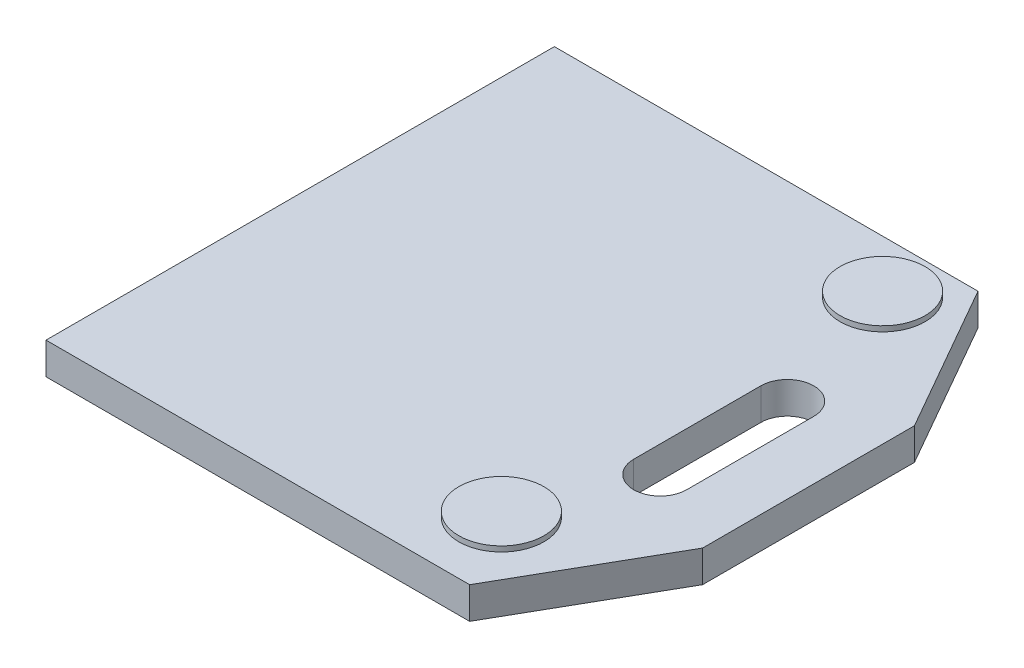
ISO-10303-21;
HEADER;
FILE_DESCRIPTION(('STEP AP214'),'2;1');
FILE_NAME('part.step','',(''),(''),'','','');
FILE_SCHEMA(('AUTOMOTIVE_DESIGN { 1 0 10303 214 1 1 1 1 }'));
ENDSEC;
DATA;
#1=APPLICATION_CONTEXT('core data for automotive mechanical design processes');
#2=APPLICATION_PROTOCOL_DEFINITION('international standard','automotive_design',2000,#1);
#3=PRODUCT_CONTEXT('',#1,'mechanical');
#4=PRODUCT('Part','Part','',(#3));
#5=PRODUCT_RELATED_PRODUCT_CATEGORY('part','',(#4));
#6=PRODUCT_DEFINITION_FORMATION('','',#4);
#7=PRODUCT_DEFINITION_CONTEXT('part definition',#1,'design');
#8=PRODUCT_DEFINITION('design','',#6,#7);
#9=PRODUCT_DEFINITION_SHAPE('','',#8);
#10=(LENGTH_UNIT() NAMED_UNIT(*) SI_UNIT(.MILLI.,.METRE.));
#11=(NAMED_UNIT(*) PLANE_ANGLE_UNIT() SI_UNIT($,.RADIAN.));
#12=(NAMED_UNIT(*) SI_UNIT($,.STERADIAN.) SOLID_ANGLE_UNIT());
#13=UNCERTAINTY_MEASURE_WITH_UNIT(LENGTH_MEASURE(1.E-05),#10,'distance_accuracy_value','');
#14=(GEOMETRIC_REPRESENTATION_CONTEXT(3) GLOBAL_UNCERTAINTY_ASSIGNED_CONTEXT((#13)) GLOBAL_UNIT_ASSIGNED_CONTEXT((#10,
#11,#12)) REPRESENTATION_CONTEXT('',''));
#15=CARTESIAN_POINT('',(0.,0.,0.));
#16=DIRECTION('',(0.,0.,1.));
#17=DIRECTION('',(1.,0.,0.));
#18=AXIS2_PLACEMENT_3D('',#15,#16,#17);
#19=CARTESIAN_POINT('',(0.,19.05,0.));
#20=DIRECTION('',(1.,0.,0.));
#21=DIRECTION('',(0.,0.,-1.));
#22=AXIS2_PLACEMENT_3D('',#19,#20,#21);
#23=PLANE('',#22);
#24=DIRECTION('',(0.,0.,1.));
#25=VECTOR('',#24,1.);
#26=CARTESIAN_POINT('',(0.,0.,0.));
#27=LINE('',#26,#25);
#28=CARTESIAN_POINT('',(0.,0.,0.));
#29=VERTEX_POINT('',#28);
#30=CARTESIAN_POINT('',(0.,0.,304.8));
#31=VERTEX_POINT('',#30);
#32=EDGE_CURVE('E156',#29,#31,#27,.T.);
#33=ORIENTED_EDGE('',*,*,#32,.T.);
#34=DIRECTION('',(0.,-1.,0.));
#35=VECTOR('',#34,1.);
#36=CARTESIAN_POINT('',(0.,19.05,304.8));
#37=LINE('',#36,#35);
#38=CARTESIAN_POINT('',(0.,19.05,304.8));
#39=VERTEX_POINT('',#38);
#40=EDGE_CURVE('E45',#39,#31,#37,.T.);
#41=ORIENTED_EDGE('',*,*,#40,.F.);
#42=DIRECTION('',(0.,0.,1.));
#43=VECTOR('',#42,1.);
#44=CARTESIAN_POINT('',(0.,19.05,0.));
#45=LINE('',#44,#43);
#46=CARTESIAN_POINT('',(0.,19.05,0.));
#47=VERTEX_POINT('',#46);
#48=EDGE_CURVE('E165',#47,#39,#45,.T.);
#49=ORIENTED_EDGE('',*,*,#48,.F.);
#50=DIRECTION('',(0.,-1.,0.));
#51=VECTOR('',#50,1.);
#52=CARTESIAN_POINT('',(0.,19.05,0.));
#53=LINE('',#52,#51);
#54=EDGE_CURVE('E179',#47,#29,#53,.T.);
#55=ORIENTED_EDGE('',*,*,#54,.T.);
#56=EDGE_LOOP('',(#33,#41,#49,#55));
#57=FACE_BOUND('',#56,.T.);
#58=ADVANCED_FACE('F39',(#57),#23,.F.);
#59=CARTESIAN_POINT('',(0.,19.05,304.8));
#60=DIRECTION('',(0.,0.,-1.));
#61=DIRECTION('',(-1.,0.,0.));
#62=AXIS2_PLACEMENT_3D('',#59,#60,#61);
#63=PLANE('',#62);
#64=DIRECTION('',(1.,0.,0.));
#65=VECTOR('',#64,1.);
#66=CARTESIAN_POINT('',(0.,0.,304.8));
#67=LINE('',#66,#65);
#68=CARTESIAN_POINT('',(254.,0.,304.8));
#69=VERTEX_POINT('',#68);
#70=EDGE_CURVE('E178',#31,#69,#67,.T.);
#71=ORIENTED_EDGE('',*,*,#70,.T.);
#72=DIRECTION('',(0.,-1.,0.));
#73=VECTOR('',#72,1.);
#74=CARTESIAN_POINT('',(254.,19.05,304.8));
#75=LINE('',#74,#73);
#76=CARTESIAN_POINT('',(254.,19.05,304.8));
#77=VERTEX_POINT('',#76);
#78=EDGE_CURVE('E196',#77,#69,#75,.T.);
#79=ORIENTED_EDGE('',*,*,#78,.F.);
#80=DIRECTION('',(1.,0.,0.));
#81=VECTOR('',#80,1.);
#82=CARTESIAN_POINT('',(0.,19.05,304.8));
#83=LINE('',#82,#81);
#84=EDGE_CURVE('E164',#39,#77,#83,.T.);
#85=ORIENTED_EDGE('',*,*,#84,.F.);
#86=ORIENTED_EDGE('',*,*,#40,.T.);
#87=EDGE_LOOP('',(#71,#79,#85,#86));
#88=FACE_BOUND('',#87,.T.);
#89=ADVANCED_FACE('F210',(#88),#63,.F.);
#90=CARTESIAN_POINT('',(304.8,19.05,215.9));
#91=DIRECTION('',(-0.868243142124459,0.,-0.496138938356833));
#92=DIRECTION('',(-0.496138938356833,0.,0.86824314212446));
#93=AXIS2_PLACEMENT_3D('',#90,#91,#92);
#94=PLANE('',#93);
#95=DIRECTION('',(0.496138938356833,0.,-0.868243142124459));
#96=VECTOR('',#95,1.);
#97=CARTESIAN_POINT('',(304.8,0.,215.9));
#98=LINE('',#97,#96);
#99=CARTESIAN_POINT('',(304.8,0.,215.9));
#100=VERTEX_POINT('',#99);
#101=EDGE_CURVE('E182',#69,#100,#98,.T.);
#102=ORIENTED_EDGE('',*,*,#101,.T.);
#103=DIRECTION('',(0.,-1.,0.));
#104=VECTOR('',#103,1.);
#105=CARTESIAN_POINT('',(304.8,19.05,215.9));
#106=LINE('',#105,#104);
#107=CARTESIAN_POINT('',(304.8,19.05,215.9));
#108=VERTEX_POINT('',#107);
#109=EDGE_CURVE('E198',#108,#100,#106,.T.);
#110=ORIENTED_EDGE('',*,*,#109,.F.);
#111=DIRECTION('',(0.496138938356833,0.,-0.868243142124459));
#112=VECTOR('',#111,1.);
#113=CARTESIAN_POINT('',(304.8,19.05,215.9));
#114=LINE('',#113,#112);
#115=EDGE_CURVE('E169',#77,#108,#114,.T.);
#116=ORIENTED_EDGE('',*,*,#115,.F.);
#117=ORIENTED_EDGE('',*,*,#78,.T.);
#118=EDGE_LOOP('',(#102,#110,#116,#117));
#119=FACE_BOUND('',#118,.T.);
#120=ADVANCED_FACE('F216',(#119),#94,.F.);
#121=CARTESIAN_POINT('',(304.8,19.05,88.9));
#122=DIRECTION('',(-1.,0.,0.));
#123=DIRECTION('',(0.,0.,1.));
#124=AXIS2_PLACEMENT_3D('',#121,#122,#123);
#125=PLANE('',#124);
#126=DIRECTION('',(0.,0.,-1.));
#127=VECTOR('',#126,1.);
#128=CARTESIAN_POINT('',(304.8,0.,88.9));
#129=LINE('',#128,#127);
#130=CARTESIAN_POINT('',(304.8,0.,88.9));
#131=VERTEX_POINT('',#130);
#132=EDGE_CURVE('E181',#100,#131,#129,.T.);
#133=ORIENTED_EDGE('',*,*,#132,.T.);
#134=DIRECTION('',(0.,-1.,0.));
#135=VECTOR('',#134,1.);
#136=CARTESIAN_POINT('',(304.8,19.05,88.9));
#137=LINE('',#136,#135);
#138=CARTESIAN_POINT('',(304.8,19.05,88.9));
#139=VERTEX_POINT('',#138);
#140=EDGE_CURVE('E195',#139,#131,#137,.T.);
#141=ORIENTED_EDGE('',*,*,#140,.F.);
#142=DIRECTION('',(0.,0.,-1.));
#143=VECTOR('',#142,1.);
#144=CARTESIAN_POINT('',(304.8,19.05,88.9));
#145=LINE('',#144,#143);
#146=EDGE_CURVE('E168',#108,#139,#145,.T.);
#147=ORIENTED_EDGE('',*,*,#146,.F.);
#148=ORIENTED_EDGE('',*,*,#109,.T.);
#149=EDGE_LOOP('',(#133,#141,#147,#148));
#150=FACE_BOUND('',#149,.T.);
#151=ADVANCED_FACE('F218',(#150),#125,.F.);
#152=CARTESIAN_POINT('',(254.,19.05,0.));
#153=DIRECTION('',(-0.868243142124459,0.,0.496138938356834));
#154=DIRECTION('',(0.496138938356834,0.,0.868243142124459));
#155=AXIS2_PLACEMENT_3D('',#152,#153,#154);
#156=PLANE('',#155);
#157=DIRECTION('',(-0.496138938356834,0.,-0.868243142124459));
#158=VECTOR('',#157,1.);
#159=CARTESIAN_POINT('',(254.,0.,0.));
#160=LINE('',#159,#158);
#161=CARTESIAN_POINT('',(254.,0.,0.));
#162=VERTEX_POINT('',#161);
#163=EDGE_CURVE('E183',#131,#162,#160,.T.);
#164=ORIENTED_EDGE('',*,*,#163,.T.);
#165=DIRECTION('',(0.,-1.,0.));
#166=VECTOR('',#165,1.);
#167=CARTESIAN_POINT('',(254.,19.05,0.));
#168=LINE('',#167,#166);
#169=CARTESIAN_POINT('',(254.,19.05,0.));
#170=VERTEX_POINT('',#169);
#171=EDGE_CURVE('E188',#170,#162,#168,.T.);
#172=ORIENTED_EDGE('',*,*,#171,.F.);
#173=DIRECTION('',(-0.496138938356834,0.,-0.868243142124459));
#174=VECTOR('',#173,1.);
#175=CARTESIAN_POINT('',(254.,19.05,0.));
#176=LINE('',#175,#174);
#177=EDGE_CURVE('E175',#139,#170,#176,.T.);
#178=ORIENTED_EDGE('',*,*,#177,.F.);
#179=ORIENTED_EDGE('',*,*,#140,.T.);
#180=EDGE_LOOP('',(#164,#172,#178,#179));
#181=FACE_BOUND('',#180,.T.);
#182=ADVANCED_FACE('F226',(#181),#156,.F.);
#183=CARTESIAN_POINT('',(0.,19.05,0.));
#184=DIRECTION('',(0.,0.,1.));
#185=DIRECTION('',(1.,0.,0.));
#186=AXIS2_PLACEMENT_3D('',#183,#184,#185);
#187=PLANE('',#186);
#188=DIRECTION('',(-1.,0.,0.));
#189=VECTOR('',#188,1.);
#190=CARTESIAN_POINT('',(0.,0.,0.));
#191=LINE('',#190,#189);
#192=EDGE_CURVE('E167',#162,#29,#191,.T.);
#193=ORIENTED_EDGE('',*,*,#192,.T.);
#194=ORIENTED_EDGE('',*,*,#54,.F.);
#195=DIRECTION('',(-1.,0.,0.));
#196=VECTOR('',#195,1.);
#197=CARTESIAN_POINT('',(0.,19.05,0.));
#198=LINE('',#197,#196);
#199=EDGE_CURVE('E171',#170,#47,#198,.T.);
#200=ORIENTED_EDGE('',*,*,#199,.F.);
#201=ORIENTED_EDGE('',*,*,#171,.T.);
#202=EDGE_LOOP('',(#193,#194,#200,#201));
#203=FACE_BOUND('',#202,.T.);
#204=ADVANCED_FACE('F230',(#203),#187,.F.);
#205=CARTESIAN_POINT('',(0.,19.05,0.));
#206=DIRECTION('',(0.,1.,0.));
#207=DIRECTION('',(0.,0.,1.));
#208=AXIS2_PLACEMENT_3D('',#205,#206,#207);
#209=PLANE('',#208);
#210=CARTESIAN_POINT('',(253.888997266355,19.05,114.231353373055));
#211=DIRECTION('',(0.,1.,0.));
#212=DIRECTION('',(0.,0.,1.));
#213=AXIS2_PLACEMENT_3D('',#210,#211,#212);
#214=CIRCLE('',#213,15.875);
#215=CARTESIAN_POINT('',(269.763997266355,19.05,114.231353373055));
#216=VERTEX_POINT('',#215);
#217=CARTESIAN_POINT('',(238.013997266355,19.05,114.231353373055));
#218=VERTEX_POINT('',#217);
#219=EDGE_CURVE('E54',#216,#218,#214,.T.);
#220=ORIENTED_EDGE('',*,*,#219,.F.);
#221=DIRECTION('',(0.,0.,-1.));
#222=VECTOR('',#221,1.);
#223=CARTESIAN_POINT('',(269.763997266355,19.05,114.231353373055));
#224=LINE('',#223,#222);
#225=CARTESIAN_POINT('',(269.763997266355,19.05,190.431353373055));
#226=VERTEX_POINT('',#225);
#227=EDGE_CURVE('E133',#226,#216,#224,.T.);
#228=ORIENTED_EDGE('',*,*,#227,.F.);
#229=CARTESIAN_POINT('',(253.888997266355,19.05,190.431353373055));
#230=DIRECTION('',(0.,1.,0.));
#231=DIRECTION('',(0.,0.,1.));
#232=AXIS2_PLACEMENT_3D('',#229,#230,#231);
#233=CIRCLE('',#232,15.875);
#234=CARTESIAN_POINT('',(238.013997266355,19.05,190.431353373055));
#235=VERTEX_POINT('',#234);
#236=EDGE_CURVE('E140',#235,#226,#233,.T.);
#237=ORIENTED_EDGE('',*,*,#236,.F.);
#238=DIRECTION('',(0.,0.,1.));
#239=VECTOR('',#238,1.);
#240=CARTESIAN_POINT('',(238.013997266355,19.05,114.231353373055));
#241=LINE('',#240,#239);
#242=EDGE_CURVE('E145',#218,#235,#241,.T.);
#243=ORIENTED_EDGE('',*,*,#242,.F.);
#244=EDGE_LOOP('',(#220,#228,#237,#243));
#245=FACE_BOUND('',#244,.T.);
#246=CARTESIAN_POINT('',(228.514370997528,19.05,31.7258407178872));
#247=DIRECTION('',(0.,1.,0.));
#248=DIRECTION('',(0.,0.,1.));
#249=AXIS2_PLACEMENT_3D('',#246,#247,#248);
#250=CIRCLE('',#249,25.4889452242265);
#251=CARTESIAN_POINT('',(228.514370997528,19.05,57.2147859421137));
#252=VERTEX_POINT('',#251);
#253=EDGE_CURVE('E11',#252,#252,#250,.T.);
#254=ORIENTED_EDGE('',*,*,#253,.F.);
#255=EDGE_LOOP('',(#254));
#256=FACE_BOUND('',#255,.T.);
#257=CARTESIAN_POINT('',(228.514370997528,19.05,260.290019101556));
#258=DIRECTION('',(0.,1.,0.));
#259=DIRECTION('',(0.,0.,1.));
#260=AXIS2_PLACEMENT_3D('',#257,#258,#259);
#261=CIRCLE('',#260,25.5110293544181);
#262=CARTESIAN_POINT('',(228.514370997528,19.05,285.801048455974));
#263=VERTEX_POINT('',#262);
#264=EDGE_CURVE('E50',#263,#263,#261,.T.);
#265=ORIENTED_EDGE('',*,*,#264,.F.);
#266=EDGE_LOOP('',(#265));
#267=FACE_BOUND('',#266,.T.);
#268=ORIENTED_EDGE('',*,*,#48,.T.);
#269=ORIENTED_EDGE('',*,*,#84,.T.);
#270=ORIENTED_EDGE('',*,*,#115,.T.);
#271=ORIENTED_EDGE('',*,*,#146,.T.);
#272=ORIENTED_EDGE('',*,*,#177,.T.);
#273=ORIENTED_EDGE('',*,*,#199,.T.);
#274=EDGE_LOOP('',(#268,#269,#270,#271,#272,#273));
#275=FACE_BOUND('',#274,.T.);
#276=ADVANCED_FACE('F224',(#245,#256,#267,#275),#209,.T.);
#277=CARTESIAN_POINT('',(0.,0.,0.));
#278=DIRECTION('',(0.,1.,0.));
#279=DIRECTION('',(0.,0.,1.));
#280=AXIS2_PLACEMENT_3D('',#277,#278,#279);
#281=PLANE('',#280);
#282=DIRECTION('',(0.,0.,-1.));
#283=VECTOR('',#282,1.);
#284=CARTESIAN_POINT('',(269.763997266355,0.,114.231353373055));
#285=LINE('',#284,#283);
#286=CARTESIAN_POINT('',(269.763997266355,0.,190.431353373055));
#287=VERTEX_POINT('',#286);
#288=CARTESIAN_POINT('',(269.763997266355,0.,114.231353373055));
#289=VERTEX_POINT('',#288);
#290=EDGE_CURVE('E122',#287,#289,#285,.T.);
#291=ORIENTED_EDGE('',*,*,#290,.T.);
#292=CARTESIAN_POINT('',(253.888997266355,0.,114.231353373055));
#293=DIRECTION('',(0.,1.,0.));
#294=DIRECTION('',(0.,0.,1.));
#295=AXIS2_PLACEMENT_3D('',#292,#293,#294);
#296=CIRCLE('',#295,15.875);
#297=CARTESIAN_POINT('',(238.013997266355,0.,114.231353373055));
#298=VERTEX_POINT('',#297);
#299=EDGE_CURVE('E116',#289,#298,#296,.T.);
#300=ORIENTED_EDGE('',*,*,#299,.T.);
#301=DIRECTION('',(0.,0.,1.));
#302=VECTOR('',#301,1.);
#303=CARTESIAN_POINT('',(238.013997266355,0.,114.231353373055));
#304=LINE('',#303,#302);
#305=CARTESIAN_POINT('',(238.013997266355,0.,190.431353373055));
#306=VERTEX_POINT('',#305);
#307=EDGE_CURVE('E126',#298,#306,#304,.T.);
#308=ORIENTED_EDGE('',*,*,#307,.T.);
#309=CARTESIAN_POINT('',(253.888997266355,0.,190.431353373055));
#310=DIRECTION('',(0.,1.,0.));
#311=DIRECTION('',(0.,0.,1.));
#312=AXIS2_PLACEMENT_3D('',#309,#310,#311);
#313=CIRCLE('',#312,15.875);
#314=EDGE_CURVE('E64',#306,#287,#313,.T.);
#315=ORIENTED_EDGE('',*,*,#314,.T.);
#316=EDGE_LOOP('',(#291,#300,#308,#315));
#317=FACE_BOUND('',#316,.T.);
#318=ORIENTED_EDGE('',*,*,#32,.F.);
#319=ORIENTED_EDGE('',*,*,#192,.F.);
#320=ORIENTED_EDGE('',*,*,#163,.F.);
#321=ORIENTED_EDGE('',*,*,#132,.F.);
#322=ORIENTED_EDGE('',*,*,#101,.F.);
#323=ORIENTED_EDGE('',*,*,#70,.F.);
#324=EDGE_LOOP('',(#318,#319,#320,#321,#322,#323));
#325=FACE_BOUND('',#324,.T.);
#326=ADVANCED_FACE('F135',(#317,#325),#281,.F.);
#327=CARTESIAN_POINT('',(228.514370997528,22.225,260.290019101556));
#328=DIRECTION('',(0.,-1.,0.));
#329=DIRECTION('',(0.,0.,-1.));
#330=AXIS2_PLACEMENT_3D('',#327,#328,#329);
#331=CYLINDRICAL_SURFACE('',#330,25.5110293544181);
#332=CARTESIAN_POINT('',(228.514370997528,22.225,260.290019101556));
#333=DIRECTION('',(0.,1.,0.));
#334=DIRECTION('',(0.,0.,1.));
#335=AXIS2_PLACEMENT_3D('',#332,#333,#334);
#336=CIRCLE('',#335,25.5110293544181);
#337=CARTESIAN_POINT('',(228.514370997528,22.225,285.801048455974));
#338=VERTEX_POINT('',#337);
#339=EDGE_CURVE('E147',#338,#338,#336,.T.);
#340=ORIENTED_EDGE('',*,*,#339,.F.);
#341=EDGE_LOOP('',(#340));
#342=FACE_BOUND('',#341,.T.);
#343=ORIENTED_EDGE('',*,*,#264,.T.);
#344=EDGE_LOOP('',(#343));
#345=FACE_BOUND('',#344,.T.);
#346=ADVANCED_FACE('F281',(#342,#345),#331,.T.);
#347=CARTESIAN_POINT('',(228.514370997528,22.225,260.290019101556));
#348=DIRECTION('',(0.,1.,0.));
#349=DIRECTION('',(0.,0.,1.));
#350=AXIS2_PLACEMENT_3D('',#347,#348,#349);
#351=PLANE('',#350);
#352=ORIENTED_EDGE('',*,*,#339,.T.);
#353=EDGE_LOOP('',(#352));
#354=FACE_BOUND('',#353,.T.);
#355=ADVANCED_FACE('F291',(#354),#351,.T.);
#356=CARTESIAN_POINT('',(228.514370997528,22.225,31.7258407178872));
#357=DIRECTION('',(0.,-1.,0.));
#358=DIRECTION('',(0.,0.,-1.));
#359=AXIS2_PLACEMENT_3D('',#356,#357,#358);
#360=CYLINDRICAL_SURFACE('',#359,25.4889452242265);
#361=CARTESIAN_POINT('',(228.514370997528,22.225,31.7258407178872));
#362=DIRECTION('',(0.,1.,0.));
#363=DIRECTION('',(0.,0.,1.));
#364=AXIS2_PLACEMENT_3D('',#361,#362,#363);
#365=CIRCLE('',#364,25.4889452242265);
#366=CARTESIAN_POINT('',(228.514370997528,22.225,57.2147859421137));
#367=VERTEX_POINT('',#366);
#368=EDGE_CURVE('E152',#367,#367,#365,.T.);
#369=ORIENTED_EDGE('',*,*,#368,.F.);
#370=EDGE_LOOP('',(#369));
#371=FACE_BOUND('',#370,.T.);
#372=ORIENTED_EDGE('',*,*,#253,.T.);
#373=EDGE_LOOP('',(#372));
#374=FACE_BOUND('',#373,.T.);
#375=ADVANCED_FACE('F305',(#371,#374),#360,.T.);
#376=CARTESIAN_POINT('',(228.514370997528,22.225,31.7258407178872));
#377=DIRECTION('',(0.,1.,0.));
#378=DIRECTION('',(0.,0.,1.));
#379=AXIS2_PLACEMENT_3D('',#376,#377,#378);
#380=PLANE('',#379);
#381=ORIENTED_EDGE('',*,*,#368,.T.);
#382=EDGE_LOOP('',(#381));
#383=FACE_BOUND('',#382,.T.);
#384=ADVANCED_FACE('F311',(#383),#380,.T.);
#385=CARTESIAN_POINT('',(253.888997266355,0.,114.231353373055));
#386=DIRECTION('',(0.,1.,0.));
#387=DIRECTION('',(0.,0.,1.));
#388=AXIS2_PLACEMENT_3D('',#385,#386,#387);
#389=CYLINDRICAL_SURFACE('',#388,15.875);
#390=ORIENTED_EDGE('',*,*,#219,.T.);
#391=DIRECTION('',(0.,1.,0.));
#392=VECTOR('',#391,1.);
#393=CARTESIAN_POINT('',(238.013997266355,0.,114.231353373055));
#394=LINE('',#393,#392);
#395=EDGE_CURVE('E113',#298,#218,#394,.T.);
#396=ORIENTED_EDGE('',*,*,#395,.F.);
#397=ORIENTED_EDGE('',*,*,#299,.F.);
#398=DIRECTION('',(0.,1.,0.));
#399=VECTOR('',#398,1.);
#400=CARTESIAN_POINT('',(269.763997266355,0.,114.231353373055));
#401=LINE('',#400,#399);
#402=EDGE_CURVE('E146',#289,#216,#401,.T.);
#403=ORIENTED_EDGE('',*,*,#402,.T.);
#404=EDGE_LOOP('',(#390,#396,#397,#403));
#405=FACE_BOUND('',#404,.T.);
#406=ADVANCED_FACE('F120',(#405),#389,.F.);
#407=CARTESIAN_POINT('',(269.763997266355,0.,114.231353373055));
#408=DIRECTION('',(1.,0.,0.));
#409=DIRECTION('',(0.,0.,-1.));
#410=AXIS2_PLACEMENT_3D('',#407,#408,#409);
#411=PLANE('',#410);
#412=ORIENTED_EDGE('',*,*,#227,.T.);
#413=ORIENTED_EDGE('',*,*,#402,.F.);
#414=ORIENTED_EDGE('',*,*,#290,.F.);
#415=DIRECTION('',(0.,1.,0.));
#416=VECTOR('',#415,1.);
#417=CARTESIAN_POINT('',(269.763997266355,0.,190.431353373055));
#418=LINE('',#417,#416);
#419=EDGE_CURVE('E151',#287,#226,#418,.T.);
#420=ORIENTED_EDGE('',*,*,#419,.T.);
#421=EDGE_LOOP('',(#412,#413,#414,#420));
#422=FACE_BOUND('',#421,.T.);
#423=ADVANCED_FACE('F329',(#422),#411,.F.);
#424=CARTESIAN_POINT('',(253.888997266355,0.,190.431353373055));
#425=DIRECTION('',(0.,1.,0.));
#426=DIRECTION('',(0.,0.,1.));
#427=AXIS2_PLACEMENT_3D('',#424,#425,#426);
#428=CYLINDRICAL_SURFACE('',#427,15.875);
#429=ORIENTED_EDGE('',*,*,#236,.T.);
#430=ORIENTED_EDGE('',*,*,#419,.F.);
#431=ORIENTED_EDGE('',*,*,#314,.F.);
#432=DIRECTION('',(0.,1.,0.));
#433=VECTOR('',#432,1.);
#434=CARTESIAN_POINT('',(238.013997266355,0.,190.431353373055));
#435=LINE('',#434,#433);
#436=EDGE_CURVE('E123',#306,#235,#435,.T.);
#437=ORIENTED_EDGE('',*,*,#436,.T.);
#438=EDGE_LOOP('',(#429,#430,#431,#437));
#439=FACE_BOUND('',#438,.T.);
#440=ADVANCED_FACE('F336',(#439),#428,.F.);
#441=CARTESIAN_POINT('',(238.013997266355,0.,114.231353373055));
#442=DIRECTION('',(-1.,0.,0.));
#443=DIRECTION('',(0.,0.,1.));
#444=AXIS2_PLACEMENT_3D('',#441,#442,#443);
#445=PLANE('',#444);
#446=ORIENTED_EDGE('',*,*,#242,.T.);
#447=ORIENTED_EDGE('',*,*,#436,.F.);
#448=ORIENTED_EDGE('',*,*,#307,.F.);
#449=ORIENTED_EDGE('',*,*,#395,.T.);
#450=EDGE_LOOP('',(#446,#447,#448,#449));
#451=FACE_BOUND('',#450,.T.);
#452=ADVANCED_FACE('F129',(#451),#445,.F.);
#453=CLOSED_SHELL('',(#58,#89,#120,#151,#182,#204,#276,#326,#346,#355,#375,#384,#406,#423,#440,#452));
#454=MANIFOLD_SOLID_BREP('B2',#453);
#455=ADVANCED_BREP_SHAPE_REPRESENTATION('',(#18,#454),#14);
#456=SHAPE_DEFINITION_REPRESENTATION(#9,#455);
ENDSEC;
END-ISO-10303-21;
